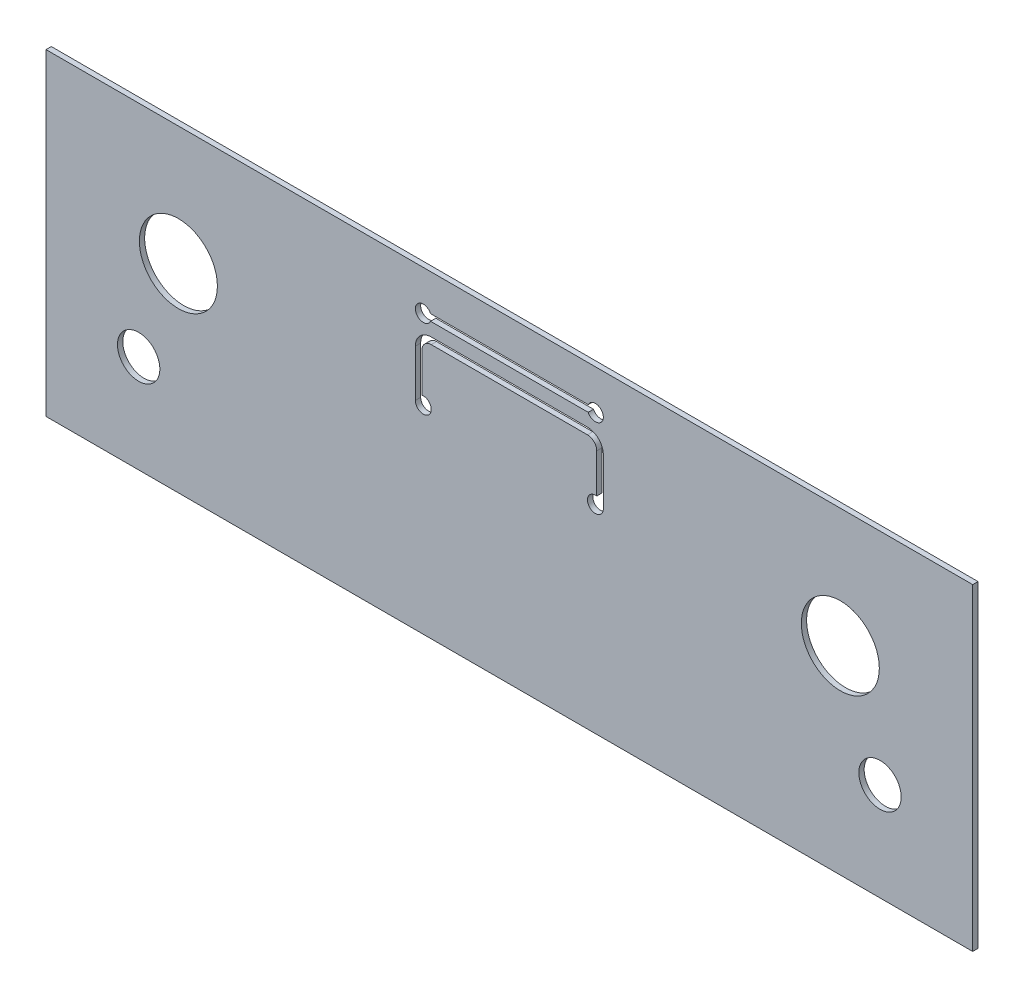
ISO-10303-21;
HEADER;
FILE_DESCRIPTION(('STEP AP214'),'2;1');
FILE_NAME('part.step','',(''),(''),'','','');
FILE_SCHEMA(('AUTOMOTIVE_DESIGN { 1 0 10303 214 1 1 1 1 }'));
ENDSEC;
DATA;
#1=APPLICATION_CONTEXT('core data for automotive mechanical design processes');
#2=APPLICATION_PROTOCOL_DEFINITION('international standard','automotive_design',2000,#1);
#3=PRODUCT_CONTEXT('',#1,'mechanical');
#4=PRODUCT('Part','Part','',(#3));
#5=PRODUCT_RELATED_PRODUCT_CATEGORY('part','',(#4));
#6=PRODUCT_DEFINITION_FORMATION('','',#4);
#7=PRODUCT_DEFINITION_CONTEXT('part definition',#1,'design');
#8=PRODUCT_DEFINITION('design','',#6,#7);
#9=PRODUCT_DEFINITION_SHAPE('','',#8);
#10=(LENGTH_UNIT() NAMED_UNIT(*) SI_UNIT(.MILLI.,.METRE.));
#11=(NAMED_UNIT(*) PLANE_ANGLE_UNIT() SI_UNIT($,.RADIAN.));
#12=(NAMED_UNIT(*) SI_UNIT($,.STERADIAN.) SOLID_ANGLE_UNIT());
#13=UNCERTAINTY_MEASURE_WITH_UNIT(LENGTH_MEASURE(1.E-05),#10,'distance_accuracy_value','');
#14=(GEOMETRIC_REPRESENTATION_CONTEXT(3) GLOBAL_UNCERTAINTY_ASSIGNED_CONTEXT((#13)) GLOBAL_UNIT_ASSIGNED_CONTEXT((#10,
#11,#12)) REPRESENTATION_CONTEXT('',''));
#15=CARTESIAN_POINT('',(0.,0.,0.));
#16=DIRECTION('',(0.,0.,1.));
#17=DIRECTION('',(1.,0.,0.));
#18=AXIS2_PLACEMENT_3D('',#15,#16,#17);
#19=CARTESIAN_POINT('',(0.,0.,0.2));
#20=DIRECTION('',(0.,0.,-1.));
#21=DIRECTION('',(-1.,0.,0.));
#22=AXIS2_PLACEMENT_3D('',#19,#20,#21);
#23=PLANE('',#22);
#24=CARTESIAN_POINT('',(30.,-4.5,0.2));
#25=DIRECTION('',(0.,0.,1.));
#26=DIRECTION('',(1.,0.,0.));
#27=AXIS2_PLACEMENT_3D('',#24,#25,#26);
#28=CIRCLE('',#27,1.4732);
#29=CARTESIAN_POINT('',(31.4732,-4.5,0.2));
#30=VERTEX_POINT('',#29);
#31=EDGE_CURVE('E201',#30,#30,#28,.T.);
#32=ORIENTED_EDGE('',*,*,#31,.F.);
#33=EDGE_LOOP('',(#32));
#34=FACE_BOUND('',#33,.T.);
#35=CARTESIAN_POINT('',(14.25,-4.5,0.2));
#36=DIRECTION('',(0.,0.,1.));
#37=DIRECTION('',(1.,0.,0.));
#38=AXIS2_PLACEMENT_3D('',#35,#36,#37);
#39=CIRCLE('',#38,0.3);
#40=CARTESIAN_POINT('',(13.95,-4.5,0.2));
#41=VERTEX_POINT('',#40);
#42=CARTESIAN_POINT('',(14.2,-4.20419601084502,0.2));
#43=VERTEX_POINT('',#42);
#44=EDGE_CURVE('E211',#41,#43,#39,.T.);
#45=ORIENTED_EDGE('',*,*,#44,.F.);
#46=DIRECTION('',(0.,-1.,0.));
#47=VECTOR('',#46,1.);
#48=CARTESIAN_POINT('',(13.95,-4.5,0.2));
#49=LINE('',#48,#47);
#50=CARTESIAN_POINT('',(13.95,-2.725,0.2));
#51=VERTEX_POINT('',#50);
#52=EDGE_CURVE('E235',#51,#41,#49,.T.);
#53=ORIENTED_EDGE('',*,*,#52,.F.);
#54=CARTESIAN_POINT('',(14.55,-2.725,0.2));
#55=DIRECTION('',(0.,0.,1.));
#56=DIRECTION('',(-1.,0.,0.));
#57=AXIS2_PLACEMENT_3D('',#54,#55,#56);
#58=CIRCLE('',#57,0.6);
#59=CARTESIAN_POINT('',(14.55,-2.125,0.2));
#60=VERTEX_POINT('',#59);
#61=EDGE_CURVE('E232',#60,#51,#58,.T.);
#62=ORIENTED_EDGE('',*,*,#61,.F.);
#63=DIRECTION('',(-1.,0.,0.));
#64=VECTOR('',#63,1.);
#65=CARTESIAN_POINT('',(14.55,-2.125,0.2));
#66=LINE('',#65,#64);
#67=CARTESIAN_POINT('',(20.45,-2.125,0.2));
#68=VERTEX_POINT('',#67);
#69=EDGE_CURVE('E230',#68,#60,#66,.T.);
#70=ORIENTED_EDGE('',*,*,#69,.F.);
#71=CARTESIAN_POINT('',(20.45,-2.725,0.2));
#72=DIRECTION('',(0.,0.,1.));
#73=DIRECTION('',(-1.,0.,0.));
#74=AXIS2_PLACEMENT_3D('',#71,#72,#73);
#75=CIRCLE('',#74,0.6);
#76=CARTESIAN_POINT('',(21.05,-2.725,0.2));
#77=VERTEX_POINT('',#76);
#78=EDGE_CURVE('E228',#77,#68,#75,.T.);
#79=ORIENTED_EDGE('',*,*,#78,.F.);
#80=DIRECTION('',(0.,1.,0.));
#81=VECTOR('',#80,1.);
#82=CARTESIAN_POINT('',(21.05,-2.725,0.2));
#83=LINE('',#82,#81);
#84=CARTESIAN_POINT('',(21.05,-4.5,0.2));
#85=VERTEX_POINT('',#84);
#86=EDGE_CURVE('E226',#85,#77,#83,.T.);
#87=ORIENTED_EDGE('',*,*,#86,.F.);
#88=CARTESIAN_POINT('',(20.75,-4.5,0.2));
#89=DIRECTION('',(0.,0.,1.));
#90=DIRECTION('',(1.,0.,0.));
#91=AXIS2_PLACEMENT_3D('',#88,#89,#90);
#92=CIRCLE('',#91,0.299999999999999);
#93=CARTESIAN_POINT('',(20.8,-4.20419601084502,0.2));
#94=VERTEX_POINT('',#93);
#95=EDGE_CURVE('E224',#94,#85,#92,.T.);
#96=ORIENTED_EDGE('',*,*,#95,.F.);
#97=DIRECTION('',(0.,-1.,0.));
#98=VECTOR('',#97,1.);
#99=CARTESIAN_POINT('',(20.8,-2.725,0.2));
#100=LINE('',#99,#98);
#101=CARTESIAN_POINT('',(20.8,-2.725,0.2));
#102=VERTEX_POINT('',#101);
#103=EDGE_CURVE('E222',#102,#94,#100,.T.);
#104=ORIENTED_EDGE('',*,*,#103,.F.);
#105=CARTESIAN_POINT('',(20.45,-2.725,0.2));
#106=DIRECTION('',(0.,0.,-1.));
#107=DIRECTION('',(-1.,0.,0.));
#108=AXIS2_PLACEMENT_3D('',#105,#106,#107);
#109=CIRCLE('',#108,0.35);
#110=CARTESIAN_POINT('',(20.45,-2.375,0.2));
#111=VERTEX_POINT('',#110);
#112=EDGE_CURVE('E220',#111,#102,#109,.T.);
#113=ORIENTED_EDGE('',*,*,#112,.F.);
#114=DIRECTION('',(1.,0.,0.));
#115=VECTOR('',#114,1.);
#116=CARTESIAN_POINT('',(14.55,-2.375,0.2));
#117=LINE('',#116,#115);
#118=CARTESIAN_POINT('',(14.55,-2.375,0.2));
#119=VERTEX_POINT('',#118);
#120=EDGE_CURVE('E218',#119,#111,#117,.T.);
#121=ORIENTED_EDGE('',*,*,#120,.F.);
#122=CARTESIAN_POINT('',(14.55,-2.725,0.2));
#123=DIRECTION('',(0.,0.,-1.));
#124=DIRECTION('',(-1.,0.,0.));
#125=AXIS2_PLACEMENT_3D('',#122,#123,#124);
#126=CIRCLE('',#125,0.35);
#127=CARTESIAN_POINT('',(14.2,-2.725,0.2));
#128=VERTEX_POINT('',#127);
#129=EDGE_CURVE('E216',#128,#119,#126,.T.);
#130=ORIENTED_EDGE('',*,*,#129,.F.);
#131=DIRECTION('',(0.,1.,0.));
#132=VECTOR('',#131,1.);
#133=CARTESIAN_POINT('',(14.2,-4.20419601084502,0.2));
#134=LINE('',#133,#132);
#135=EDGE_CURVE('E213',#43,#128,#134,.T.);
#136=ORIENTED_EDGE('',*,*,#135,.F.);
#137=EDGE_LOOP('',(#45,#53,#62,#70,#79,#87,#96,#104,#113,#121,#130,#136));
#138=FACE_BOUND('',#137,.T.);
#139=CARTESIAN_POINT('',(3.5,-8.3,0.2));
#140=DIRECTION('',(0.,0.,1.));
#141=DIRECTION('',(1.,0.,0.));
#142=AXIS2_PLACEMENT_3D('',#139,#140,#141);
#143=CIRCLE('',#142,0.800100000000002);
#144=CARTESIAN_POINT('',(4.3001,-8.3,0.2));
#145=VERTEX_POINT('',#144);
#146=EDGE_CURVE('E304',#145,#145,#143,.T.);
#147=ORIENTED_EDGE('',*,*,#146,.F.);
#148=EDGE_LOOP('',(#147));
#149=FACE_BOUND('',#148,.T.);
#150=DIRECTION('',(0.,-1.,0.));
#151=VECTOR('',#150,1.);
#152=CARTESIAN_POINT('',(0.,-12.,0.2));
#153=LINE('',#152,#151);
#154=CARTESIAN_POINT('',(0.,0.,0.2));
#155=VERTEX_POINT('',#154);
#156=CARTESIAN_POINT('',(0.,-12.,0.2));
#157=VERTEX_POINT('',#156);
#158=EDGE_CURVE('E310',#155,#157,#153,.T.);
#159=ORIENTED_EDGE('',*,*,#158,.T.);
#160=DIRECTION('',(1.,0.,0.));
#161=VECTOR('',#160,1.);
#162=CARTESIAN_POINT('',(35.,-12.,0.2));
#163=LINE('',#162,#161);
#164=CARTESIAN_POINT('',(35.,-12.,0.2));
#165=VERTEX_POINT('',#164);
#166=EDGE_CURVE('E313',#157,#165,#163,.T.);
#167=ORIENTED_EDGE('',*,*,#166,.T.);
#168=DIRECTION('',(0.,1.,0.));
#169=VECTOR('',#168,1.);
#170=CARTESIAN_POINT('',(35.,0.,0.2));
#171=LINE('',#170,#169);
#172=CARTESIAN_POINT('',(35.,0.,0.2));
#173=VERTEX_POINT('',#172);
#174=EDGE_CURVE('E316',#165,#173,#171,.T.);
#175=ORIENTED_EDGE('',*,*,#174,.T.);
#176=DIRECTION('',(-1.,0.,0.));
#177=VECTOR('',#176,1.);
#178=CARTESIAN_POINT('',(0.,0.,0.2));
#179=LINE('',#178,#177);
#180=EDGE_CURVE('E318',#173,#155,#179,.T.);
#181=ORIENTED_EDGE('',*,*,#180,.T.);
#182=EDGE_LOOP('',(#159,#167,#175,#181));
#183=FACE_BOUND('',#182,.T.);
#184=CARTESIAN_POINT('',(5.,-4.5,0.2));
#185=DIRECTION('',(0.,0.,1.));
#186=DIRECTION('',(1.,0.,0.));
#187=AXIS2_PLACEMENT_3D('',#184,#185,#186);
#188=CIRCLE('',#187,1.4732);
#189=CARTESIAN_POINT('',(6.4732,-4.5,0.2));
#190=VERTEX_POINT('',#189);
#191=EDGE_CURVE('E298',#190,#190,#188,.T.);
#192=ORIENTED_EDGE('',*,*,#191,.F.);
#193=EDGE_LOOP('',(#192));
#194=FACE_BOUND('',#193,.T.);
#195=CARTESIAN_POINT('',(14.25,-1.5,0.2));
#196=DIRECTION('',(0.,0.,1.));
#197=DIRECTION('',(1.,0.,0.));
#198=AXIS2_PLACEMENT_3D('',#195,#196,#197);
#199=CIRCLE('',#198,0.299999999999999);
#200=CARTESIAN_POINT('',(14.5227178028659,-1.375,0.2));
#201=VERTEX_POINT('',#200);
#202=CARTESIAN_POINT('',(14.5227178028659,-1.625,0.2));
#203=VERTEX_POINT('',#202);
#204=EDGE_CURVE('E172',#201,#203,#199,.T.);
#205=ORIENTED_EDGE('',*,*,#204,.F.);
#206=DIRECTION('',(-1.,0.,0.));
#207=VECTOR('',#206,1.);
#208=CARTESIAN_POINT('',(14.5227178028659,-1.375,0.2));
#209=LINE('',#208,#207);
#210=CARTESIAN_POINT('',(20.4772821971341,-1.375,0.2));
#211=VERTEX_POINT('',#210);
#212=EDGE_CURVE('E195',#211,#201,#209,.T.);
#213=ORIENTED_EDGE('',*,*,#212,.F.);
#214=CARTESIAN_POINT('',(20.75,-1.5,0.2));
#215=DIRECTION('',(0.,0.,1.));
#216=DIRECTION('',(1.,0.,0.));
#217=AXIS2_PLACEMENT_3D('',#214,#215,#216);
#218=CIRCLE('',#217,0.300000000000001);
#219=CARTESIAN_POINT('',(20.4772821971341,-1.625,0.2));
#220=VERTEX_POINT('',#219);
#221=EDGE_CURVE('E193',#220,#211,#218,.T.);
#222=ORIENTED_EDGE('',*,*,#221,.F.);
#223=DIRECTION('',(1.,0.,0.));
#224=VECTOR('',#223,1.);
#225=CARTESIAN_POINT('',(14.5227178028659,-1.625,0.2));
#226=LINE('',#225,#224);
#227=EDGE_CURVE('E180',#203,#220,#226,.T.);
#228=ORIENTED_EDGE('',*,*,#227,.F.);
#229=EDGE_LOOP('',(#205,#213,#222,#228));
#230=FACE_BOUND('',#229,.T.);
#231=CARTESIAN_POINT('',(31.5,-8.3,0.2));
#232=DIRECTION('',(0.,0.,1.));
#233=DIRECTION('',(1.,0.,0.));
#234=AXIS2_PLACEMENT_3D('',#231,#232,#233);
#235=CIRCLE('',#234,0.800100000000007);
#236=CARTESIAN_POINT('',(32.3001,-8.3,0.2));
#237=VERTEX_POINT('',#236);
#238=EDGE_CURVE('E465',#237,#237,#235,.T.);
#239=ORIENTED_EDGE('',*,*,#238,.F.);
#240=EDGE_LOOP('',(#239));
#241=FACE_BOUND('',#240,.T.);
#242=ADVANCED_FACE('F35',(#34,#138,#149,#183,#194,#230,#241),#23,.F.);
#243=CARTESIAN_POINT('',(0.,0.,0.));
#244=DIRECTION('',(0.,0.,-1.));
#245=DIRECTION('',(-1.,0.,0.));
#246=AXIS2_PLACEMENT_3D('',#243,#244,#245);
#247=PLANE('',#246);
#248=CARTESIAN_POINT('',(30.,-4.5,0.));
#249=DIRECTION('',(0.,0.,1.));
#250=DIRECTION('',(1.,0.,0.));
#251=AXIS2_PLACEMENT_3D('',#248,#249,#250);
#252=CIRCLE('',#251,1.4732);
#253=CARTESIAN_POINT('',(31.4732,-4.5,0.));
#254=VERTEX_POINT('',#253);
#255=EDGE_CURVE('E471',#254,#254,#252,.T.);
#256=ORIENTED_EDGE('',*,*,#255,.T.);
#257=EDGE_LOOP('',(#256));
#258=FACE_BOUND('',#257,.T.);
#259=DIRECTION('',(0.,-1.,0.));
#260=VECTOR('',#259,1.);
#261=CARTESIAN_POINT('',(13.95,-4.5,0.));
#262=LINE('',#261,#260);
#263=CARTESIAN_POINT('',(13.95,-2.725,0.));
#264=VERTEX_POINT('',#263);
#265=CARTESIAN_POINT('',(13.95,-4.5,0.));
#266=VERTEX_POINT('',#265);
#267=EDGE_CURVE('E214',#264,#266,#262,.T.);
#268=ORIENTED_EDGE('',*,*,#267,.T.);
#269=CARTESIAN_POINT('',(14.25,-4.5,0.));
#270=DIRECTION('',(0.,0.,1.));
#271=DIRECTION('',(1.,0.,0.));
#272=AXIS2_PLACEMENT_3D('',#269,#270,#271);
#273=CIRCLE('',#272,0.3);
#274=CARTESIAN_POINT('',(14.2,-4.20419601084502,0.));
#275=VERTEX_POINT('',#274);
#276=EDGE_CURVE('E188',#266,#275,#273,.T.);
#277=ORIENTED_EDGE('',*,*,#276,.T.);
#278=DIRECTION('',(0.,1.,0.));
#279=VECTOR('',#278,1.);
#280=CARTESIAN_POINT('',(14.2,-4.20419601084502,0.));
#281=LINE('',#280,#279);
#282=CARTESIAN_POINT('',(14.2,-2.725,0.));
#283=VERTEX_POINT('',#282);
#284=EDGE_CURVE('E240',#275,#283,#281,.T.);
#285=ORIENTED_EDGE('',*,*,#284,.T.);
#286=CARTESIAN_POINT('',(14.55,-2.725,0.));
#287=DIRECTION('',(0.,0.,-1.));
#288=DIRECTION('',(-1.,0.,0.));
#289=AXIS2_PLACEMENT_3D('',#286,#287,#288);
#290=CIRCLE('',#289,0.35);
#291=CARTESIAN_POINT('',(14.55,-2.375,0.));
#292=VERTEX_POINT('',#291);
#293=EDGE_CURVE('E243',#283,#292,#290,.T.);
#294=ORIENTED_EDGE('',*,*,#293,.T.);
#295=DIRECTION('',(1.,0.,0.));
#296=VECTOR('',#295,1.);
#297=CARTESIAN_POINT('',(14.55,-2.375,0.));
#298=LINE('',#297,#296);
#299=CARTESIAN_POINT('',(20.45,-2.375,0.));
#300=VERTEX_POINT('',#299);
#301=EDGE_CURVE('E246',#292,#300,#298,.T.);
#302=ORIENTED_EDGE('',*,*,#301,.T.);
#303=CARTESIAN_POINT('',(20.45,-2.725,0.));
#304=DIRECTION('',(0.,0.,-1.));
#305=DIRECTION('',(-1.,0.,0.));
#306=AXIS2_PLACEMENT_3D('',#303,#304,#305);
#307=CIRCLE('',#306,0.35);
#308=CARTESIAN_POINT('',(20.8,-2.725,0.));
#309=VERTEX_POINT('',#308);
#310=EDGE_CURVE('E249',#300,#309,#307,.T.);
#311=ORIENTED_EDGE('',*,*,#310,.T.);
#312=DIRECTION('',(0.,-1.,0.));
#313=VECTOR('',#312,1.);
#314=CARTESIAN_POINT('',(20.8,-2.725,0.));
#315=LINE('',#314,#313);
#316=CARTESIAN_POINT('',(20.8,-4.20419601084502,0.));
#317=VERTEX_POINT('',#316);
#318=EDGE_CURVE('E252',#309,#317,#315,.T.);
#319=ORIENTED_EDGE('',*,*,#318,.T.);
#320=CARTESIAN_POINT('',(20.75,-4.5,0.));
#321=DIRECTION('',(0.,0.,1.));
#322=DIRECTION('',(1.,0.,0.));
#323=AXIS2_PLACEMENT_3D('',#320,#321,#322);
#324=CIRCLE('',#323,0.299999999999999);
#325=CARTESIAN_POINT('',(21.05,-4.5,0.));
#326=VERTEX_POINT('',#325);
#327=EDGE_CURVE('E255',#317,#326,#324,.T.);
#328=ORIENTED_EDGE('',*,*,#327,.T.);
#329=DIRECTION('',(0.,1.,0.));
#330=VECTOR('',#329,1.);
#331=CARTESIAN_POINT('',(21.05,-2.725,0.));
#332=LINE('',#331,#330);
#333=CARTESIAN_POINT('',(21.05,-2.725,0.));
#334=VERTEX_POINT('',#333);
#335=EDGE_CURVE('E258',#326,#334,#332,.T.);
#336=ORIENTED_EDGE('',*,*,#335,.T.);
#337=CARTESIAN_POINT('',(20.45,-2.725,0.));
#338=DIRECTION('',(0.,0.,1.));
#339=DIRECTION('',(-1.,0.,0.));
#340=AXIS2_PLACEMENT_3D('',#337,#338,#339);
#341=CIRCLE('',#340,0.6);
#342=CARTESIAN_POINT('',(20.45,-2.125,0.));
#343=VERTEX_POINT('',#342);
#344=EDGE_CURVE('E261',#334,#343,#341,.T.);
#345=ORIENTED_EDGE('',*,*,#344,.T.);
#346=DIRECTION('',(-1.,0.,0.));
#347=VECTOR('',#346,1.);
#348=CARTESIAN_POINT('',(14.55,-2.125,0.));
#349=LINE('',#348,#347);
#350=CARTESIAN_POINT('',(14.55,-2.125,0.));
#351=VERTEX_POINT('',#350);
#352=EDGE_CURVE('E264',#343,#351,#349,.T.);
#353=ORIENTED_EDGE('',*,*,#352,.T.);
#354=CARTESIAN_POINT('',(14.55,-2.725,0.));
#355=DIRECTION('',(0.,0.,1.));
#356=DIRECTION('',(-1.,0.,0.));
#357=AXIS2_PLACEMENT_3D('',#354,#355,#356);
#358=CIRCLE('',#357,0.6);
#359=EDGE_CURVE('E267',#351,#264,#358,.T.);
#360=ORIENTED_EDGE('',*,*,#359,.T.);
#361=EDGE_LOOP('',(#268,#277,#285,#294,#302,#311,#319,#328,#336,#345,#353,#360));
#362=FACE_BOUND('',#361,.T.);
#363=CARTESIAN_POINT('',(3.5,-8.3,0.));
#364=DIRECTION('',(0.,0.,1.));
#365=DIRECTION('',(1.,0.,0.));
#366=AXIS2_PLACEMENT_3D('',#363,#364,#365);
#367=CIRCLE('',#366,0.800100000000002);
#368=CARTESIAN_POINT('',(4.3001,-8.3,0.));
#369=VERTEX_POINT('',#368);
#370=EDGE_CURVE('E301',#369,#369,#367,.T.);
#371=ORIENTED_EDGE('',*,*,#370,.T.);
#372=EDGE_LOOP('',(#371));
#373=FACE_BOUND('',#372,.T.);
#374=DIRECTION('',(0.,-1.,0.));
#375=VECTOR('',#374,1.);
#376=CARTESIAN_POINT('',(0.,-12.,0.));
#377=LINE('',#376,#375);
#378=CARTESIAN_POINT('',(0.,0.,0.));
#379=VERTEX_POINT('',#378);
#380=CARTESIAN_POINT('',(0.,-12.,0.));
#381=VERTEX_POINT('',#380);
#382=EDGE_CURVE('E307',#379,#381,#377,.T.);
#383=ORIENTED_EDGE('',*,*,#382,.F.);
#384=DIRECTION('',(-1.,0.,0.));
#385=VECTOR('',#384,1.);
#386=CARTESIAN_POINT('',(0.,0.,0.));
#387=LINE('',#386,#385);
#388=CARTESIAN_POINT('',(35.,0.,0.));
#389=VERTEX_POINT('',#388);
#390=EDGE_CURVE('E314',#389,#379,#387,.T.);
#391=ORIENTED_EDGE('',*,*,#390,.F.);
#392=DIRECTION('',(0.,1.,0.));
#393=VECTOR('',#392,1.);
#394=CARTESIAN_POINT('',(35.,0.,0.));
#395=LINE('',#394,#393);
#396=CARTESIAN_POINT('',(35.,-12.,0.));
#397=VERTEX_POINT('',#396);
#398=EDGE_CURVE('E325',#397,#389,#395,.T.);
#399=ORIENTED_EDGE('',*,*,#398,.F.);
#400=DIRECTION('',(1.,0.,0.));
#401=VECTOR('',#400,1.);
#402=CARTESIAN_POINT('',(35.,-12.,0.));
#403=LINE('',#402,#401);
#404=EDGE_CURVE('E323',#381,#397,#403,.T.);
#405=ORIENTED_EDGE('',*,*,#404,.F.);
#406=EDGE_LOOP('',(#383,#391,#399,#405));
#407=FACE_BOUND('',#406,.T.);
#408=CARTESIAN_POINT('',(5.,-4.5,0.));
#409=DIRECTION('',(0.,0.,1.));
#410=DIRECTION('',(1.,0.,0.));
#411=AXIS2_PLACEMENT_3D('',#408,#409,#410);
#412=CIRCLE('',#411,1.4732);
#413=CARTESIAN_POINT('',(6.4732,-4.5,0.));
#414=VERTEX_POINT('',#413);
#415=EDGE_CURVE('E297',#414,#414,#412,.T.);
#416=ORIENTED_EDGE('',*,*,#415,.T.);
#417=EDGE_LOOP('',(#416));
#418=FACE_BOUND('',#417,.T.);
#419=DIRECTION('',(-1.,0.,0.));
#420=VECTOR('',#419,1.);
#421=CARTESIAN_POINT('',(14.5227178028659,-1.375,0.));
#422=LINE('',#421,#420);
#423=CARTESIAN_POINT('',(20.4772821971341,-1.375,0.));
#424=VERTEX_POINT('',#423);
#425=CARTESIAN_POINT('',(14.5227178028659,-1.375,0.));
#426=VERTEX_POINT('',#425);
#427=EDGE_CURVE('E181',#424,#426,#422,.T.);
#428=ORIENTED_EDGE('',*,*,#427,.T.);
#429=CARTESIAN_POINT('',(14.25,-1.5,0.));
#430=DIRECTION('',(0.,0.,1.));
#431=DIRECTION('',(1.,0.,0.));
#432=AXIS2_PLACEMENT_3D('',#429,#430,#431);
#433=CIRCLE('',#432,0.299999999999999);
#434=CARTESIAN_POINT('',(14.5227178028659,-1.625,0.));
#435=VERTEX_POINT('',#434);
#436=EDGE_CURVE('E58',#426,#435,#433,.T.);
#437=ORIENTED_EDGE('',*,*,#436,.T.);
#438=DIRECTION('',(1.,0.,0.));
#439=VECTOR('',#438,1.);
#440=CARTESIAN_POINT('',(14.5227178028659,-1.625,0.));
#441=LINE('',#440,#439);
#442=CARTESIAN_POINT('',(20.4772821971341,-1.625,0.));
#443=VERTEX_POINT('',#442);
#444=EDGE_CURVE('E187',#435,#443,#441,.T.);
#445=ORIENTED_EDGE('',*,*,#444,.T.);
#446=CARTESIAN_POINT('',(20.75,-1.5,0.));
#447=DIRECTION('',(0.,0.,1.));
#448=DIRECTION('',(1.,0.,0.));
#449=AXIS2_PLACEMENT_3D('',#446,#447,#448);
#450=CIRCLE('',#449,0.300000000000001);
#451=EDGE_CURVE('E203',#443,#424,#450,.T.);
#452=ORIENTED_EDGE('',*,*,#451,.T.);
#453=EDGE_LOOP('',(#428,#437,#445,#452));
#454=FACE_BOUND('',#453,.T.);
#455=CARTESIAN_POINT('',(31.5,-8.3,0.));
#456=DIRECTION('',(0.,0.,1.));
#457=DIRECTION('',(1.,0.,0.));
#458=AXIS2_PLACEMENT_3D('',#455,#456,#457);
#459=CIRCLE('',#458,0.800100000000007);
#460=CARTESIAN_POINT('',(32.3001,-8.3,0.));
#461=VERTEX_POINT('',#460);
#462=EDGE_CURVE('E468',#461,#461,#459,.T.);
#463=ORIENTED_EDGE('',*,*,#462,.T.);
#464=EDGE_LOOP('',(#463));
#465=FACE_BOUND('',#464,.T.);
#466=ADVANCED_FACE('F343',(#258,#362,#373,#407,#418,#454,#465),#247,.T.);
#467=CARTESIAN_POINT('',(0.,-12.,0.2));
#468=DIRECTION('',(1.,0.,0.));
#469=DIRECTION('',(0.,0.,-1.));
#470=AXIS2_PLACEMENT_3D('',#467,#468,#469);
#471=PLANE('',#470);
#472=ORIENTED_EDGE('',*,*,#382,.T.);
#473=DIRECTION('',(0.,0.,-1.));
#474=VECTOR('',#473,1.);
#475=CARTESIAN_POINT('',(0.,-12.,0.2));
#476=LINE('',#475,#474);
#477=EDGE_CURVE('E11',#157,#381,#476,.T.);
#478=ORIENTED_EDGE('',*,*,#477,.F.);
#479=ORIENTED_EDGE('',*,*,#158,.F.);
#480=DIRECTION('',(0.,0.,-1.));
#481=VECTOR('',#480,1.);
#482=CARTESIAN_POINT('',(0.,0.,0.2));
#483=LINE('',#482,#481);
#484=EDGE_CURVE('E320',#155,#379,#483,.T.);
#485=ORIENTED_EDGE('',*,*,#484,.T.);
#486=EDGE_LOOP('',(#472,#478,#479,#485));
#487=FACE_BOUND('',#486,.T.);
#488=ADVANCED_FACE('F37',(#487),#471,.F.);
#489=CARTESIAN_POINT('',(35.,-12.,0.2));
#490=DIRECTION('',(0.,1.,0.));
#491=DIRECTION('',(-1.,0.,0.));
#492=AXIS2_PLACEMENT_3D('',#489,#490,#491);
#493=PLANE('',#492);
#494=ORIENTED_EDGE('',*,*,#404,.T.);
#495=DIRECTION('',(0.,0.,-1.));
#496=VECTOR('',#495,1.);
#497=CARTESIAN_POINT('',(35.,-12.,0.2));
#498=LINE('',#497,#496);
#499=EDGE_CURVE('E43',#165,#397,#498,.T.);
#500=ORIENTED_EDGE('',*,*,#499,.F.);
#501=ORIENTED_EDGE('',*,*,#166,.F.);
#502=ORIENTED_EDGE('',*,*,#477,.T.);
#503=EDGE_LOOP('',(#494,#500,#501,#502));
#504=FACE_BOUND('',#503,.T.);
#505=ADVANCED_FACE('F354',(#504),#493,.F.);
#506=CARTESIAN_POINT('',(35.,0.,0.2));
#507=DIRECTION('',(-1.,0.,0.));
#508=DIRECTION('',(0.,0.,1.));
#509=AXIS2_PLACEMENT_3D('',#506,#507,#508);
#510=PLANE('',#509);
#511=ORIENTED_EDGE('',*,*,#398,.T.);
#512=DIRECTION('',(0.,0.,-1.));
#513=VECTOR('',#512,1.);
#514=CARTESIAN_POINT('',(35.,0.,0.2));
#515=LINE('',#514,#513);
#516=EDGE_CURVE('E330',#173,#389,#515,.T.);
#517=ORIENTED_EDGE('',*,*,#516,.F.);
#518=ORIENTED_EDGE('',*,*,#174,.F.);
#519=ORIENTED_EDGE('',*,*,#499,.T.);
#520=EDGE_LOOP('',(#511,#517,#518,#519));
#521=FACE_BOUND('',#520,.T.);
#522=ADVANCED_FACE('F337',(#521),#510,.F.);
#523=CARTESIAN_POINT('',(0.,0.,0.2));
#524=DIRECTION('',(0.,-1.,0.));
#525=DIRECTION('',(0.,0.,-1.));
#526=AXIS2_PLACEMENT_3D('',#523,#524,#525);
#527=PLANE('',#526);
#528=ORIENTED_EDGE('',*,*,#390,.T.);
#529=ORIENTED_EDGE('',*,*,#484,.F.);
#530=ORIENTED_EDGE('',*,*,#180,.F.);
#531=ORIENTED_EDGE('',*,*,#516,.T.);
#532=EDGE_LOOP('',(#528,#529,#530,#531));
#533=FACE_BOUND('',#532,.T.);
#534=ADVANCED_FACE('F347',(#533),#527,.F.);
#535=CARTESIAN_POINT('',(3.5,-8.3,0.2));
#536=DIRECTION('',(0.,0.,-1.));
#537=DIRECTION('',(-1.,0.,0.));
#538=AXIS2_PLACEMENT_3D('',#535,#536,#537);
#539=CYLINDRICAL_SURFACE('',#538,0.800100000000002);
#540=ORIENTED_EDGE('',*,*,#146,.T.);
#541=EDGE_LOOP('',(#540));
#542=FACE_BOUND('',#541,.T.);
#543=ORIENTED_EDGE('',*,*,#370,.F.);
#544=EDGE_LOOP('',(#543));
#545=FACE_BOUND('',#544,.T.);
#546=ADVANCED_FACE('F372',(#542,#545),#539,.F.);
#547=CARTESIAN_POINT('',(5.,-4.5,0.2));
#548=DIRECTION('',(0.,0.,-1.));
#549=DIRECTION('',(-1.,0.,0.));
#550=AXIS2_PLACEMENT_3D('',#547,#548,#549);
#551=CYLINDRICAL_SURFACE('',#550,1.4732);
#552=ORIENTED_EDGE('',*,*,#191,.T.);
#553=EDGE_LOOP('',(#552));
#554=FACE_BOUND('',#553,.T.);
#555=ORIENTED_EDGE('',*,*,#415,.F.);
#556=EDGE_LOOP('',(#555));
#557=FACE_BOUND('',#556,.T.);
#558=ADVANCED_FACE('F379',(#554,#557),#551,.F.);
#559=CARTESIAN_POINT('',(14.25,-4.5,0.2));
#560=DIRECTION('',(0.,0.,-1.));
#561=DIRECTION('',(-1.,0.,0.));
#562=AXIS2_PLACEMENT_3D('',#559,#560,#561);
#563=CYLINDRICAL_SURFACE('',#562,0.3);
#564=ORIENTED_EDGE('',*,*,#276,.F.);
#565=DIRECTION('',(0.,0.,-1.));
#566=VECTOR('',#565,1.);
#567=CARTESIAN_POINT('',(13.95,-4.5,0.2));
#568=LINE('',#567,#566);
#569=EDGE_CURVE('E237',#41,#266,#568,.T.);
#570=ORIENTED_EDGE('',*,*,#569,.F.);
#571=ORIENTED_EDGE('',*,*,#44,.T.);
#572=DIRECTION('',(0.,0.,-1.));
#573=VECTOR('',#572,1.);
#574=CARTESIAN_POINT('',(14.2,-4.20419601084502,0.2));
#575=LINE('',#574,#573);
#576=EDGE_CURVE('E294',#43,#275,#575,.T.);
#577=ORIENTED_EDGE('',*,*,#576,.T.);
#578=EDGE_LOOP('',(#564,#570,#571,#577));
#579=FACE_BOUND('',#578,.T.);
#580=ADVANCED_FACE('F384',(#579),#563,.F.);
#581=CARTESIAN_POINT('',(14.2,-4.20419601084502,0.2));
#582=DIRECTION('',(-1.,0.,0.));
#583=DIRECTION('',(0.,0.,1.));
#584=AXIS2_PLACEMENT_3D('',#581,#582,#583);
#585=PLANE('',#584);
#586=ORIENTED_EDGE('',*,*,#284,.F.);
#587=ORIENTED_EDGE('',*,*,#576,.F.);
#588=ORIENTED_EDGE('',*,*,#135,.T.);
#589=DIRECTION('',(0.,0.,-1.));
#590=VECTOR('',#589,1.);
#591=CARTESIAN_POINT('',(14.2,-2.725,0.2));
#592=LINE('',#591,#590);
#593=EDGE_CURVE('E292',#128,#283,#592,.T.);
#594=ORIENTED_EDGE('',*,*,#593,.T.);
#595=EDGE_LOOP('',(#586,#587,#588,#594));
#596=FACE_BOUND('',#595,.T.);
#597=ADVANCED_FACE('F394',(#596),#585,.T.);
#598=CARTESIAN_POINT('',(14.55,-2.725,0.2));
#599=DIRECTION('',(0.,0.,-1.));
#600=DIRECTION('',(-1.,0.,0.));
#601=AXIS2_PLACEMENT_3D('',#598,#599,#600);
#602=CYLINDRICAL_SURFACE('',#601,0.35);
#603=ORIENTED_EDGE('',*,*,#293,.F.);
#604=ORIENTED_EDGE('',*,*,#593,.F.);
#605=ORIENTED_EDGE('',*,*,#129,.T.);
#606=DIRECTION('',(0.,0.,-1.));
#607=VECTOR('',#606,1.);
#608=CARTESIAN_POINT('',(14.55,-2.375,0.2));
#609=LINE('',#608,#607);
#610=EDGE_CURVE('E290',#119,#292,#609,.T.);
#611=ORIENTED_EDGE('',*,*,#610,.T.);
#612=EDGE_LOOP('',(#603,#604,#605,#611));
#613=FACE_BOUND('',#612,.T.);
#614=ADVANCED_FACE('F401',(#613),#602,.T.);
#615=CARTESIAN_POINT('',(14.55,-2.375,0.2));
#616=DIRECTION('',(0.,1.,0.));
#617=DIRECTION('',(-1.,0.,0.));
#618=AXIS2_PLACEMENT_3D('',#615,#616,#617);
#619=PLANE('',#618);
#620=ORIENTED_EDGE('',*,*,#301,.F.);
#621=ORIENTED_EDGE('',*,*,#610,.F.);
#622=ORIENTED_EDGE('',*,*,#120,.T.);
#623=DIRECTION('',(0.,0.,-1.));
#624=VECTOR('',#623,1.);
#625=CARTESIAN_POINT('',(20.45,-2.375,0.2));
#626=LINE('',#625,#624);
#627=EDGE_CURVE('E288',#111,#300,#626,.T.);
#628=ORIENTED_EDGE('',*,*,#627,.T.);
#629=EDGE_LOOP('',(#620,#621,#622,#628));
#630=FACE_BOUND('',#629,.T.);
#631=ADVANCED_FACE('F405',(#630),#619,.T.);
#632=CARTESIAN_POINT('',(20.45,-2.725,0.2));
#633=DIRECTION('',(0.,0.,-1.));
#634=DIRECTION('',(-1.,0.,0.));
#635=AXIS2_PLACEMENT_3D('',#632,#633,#634);
#636=CYLINDRICAL_SURFACE('',#635,0.35);
#637=ORIENTED_EDGE('',*,*,#310,.F.);
#638=ORIENTED_EDGE('',*,*,#627,.F.);
#639=ORIENTED_EDGE('',*,*,#112,.T.);
#640=DIRECTION('',(0.,0.,-1.));
#641=VECTOR('',#640,1.);
#642=CARTESIAN_POINT('',(20.8,-2.725,0.2));
#643=LINE('',#642,#641);
#644=EDGE_CURVE('E286',#102,#309,#643,.T.);
#645=ORIENTED_EDGE('',*,*,#644,.T.);
#646=EDGE_LOOP('',(#637,#638,#639,#645));
#647=FACE_BOUND('',#646,.T.);
#648=ADVANCED_FACE('F409',(#647),#636,.T.);
#649=CARTESIAN_POINT('',(20.8,-2.725,0.2));
#650=DIRECTION('',(1.,0.,0.));
#651=DIRECTION('',(0.,0.,-1.));
#652=AXIS2_PLACEMENT_3D('',#649,#650,#651);
#653=PLANE('',#652);
#654=ORIENTED_EDGE('',*,*,#318,.F.);
#655=ORIENTED_EDGE('',*,*,#644,.F.);
#656=ORIENTED_EDGE('',*,*,#103,.T.);
#657=DIRECTION('',(0.,0.,-1.));
#658=VECTOR('',#657,1.);
#659=CARTESIAN_POINT('',(20.8,-4.20419601084502,0.2));
#660=LINE('',#659,#658);
#661=EDGE_CURVE('E284',#94,#317,#660,.T.);
#662=ORIENTED_EDGE('',*,*,#661,.T.);
#663=EDGE_LOOP('',(#654,#655,#656,#662));
#664=FACE_BOUND('',#663,.T.);
#665=ADVANCED_FACE('F413',(#664),#653,.T.);
#666=CARTESIAN_POINT('',(20.75,-4.5,0.2));
#667=DIRECTION('',(0.,0.,-1.));
#668=DIRECTION('',(-1.,0.,0.));
#669=AXIS2_PLACEMENT_3D('',#666,#667,#668);
#670=CYLINDRICAL_SURFACE('',#669,0.299999999999999);
#671=ORIENTED_EDGE('',*,*,#327,.F.);
#672=ORIENTED_EDGE('',*,*,#661,.F.);
#673=ORIENTED_EDGE('',*,*,#95,.T.);
#674=DIRECTION('',(0.,0.,-1.));
#675=VECTOR('',#674,1.);
#676=CARTESIAN_POINT('',(21.05,-4.5,0.2));
#677=LINE('',#676,#675);
#678=EDGE_CURVE('E282',#85,#326,#677,.T.);
#679=ORIENTED_EDGE('',*,*,#678,.T.);
#680=EDGE_LOOP('',(#671,#672,#673,#679));
#681=FACE_BOUND('',#680,.T.);
#682=ADVANCED_FACE('F417',(#681),#670,.F.);
#683=CARTESIAN_POINT('',(21.05,-2.725,0.2));
#684=DIRECTION('',(-1.,0.,0.));
#685=DIRECTION('',(0.,-1.,0.));
#686=AXIS2_PLACEMENT_3D('',#683,#684,#685);
#687=PLANE('',#686);
#688=ORIENTED_EDGE('',*,*,#335,.F.);
#689=ORIENTED_EDGE('',*,*,#678,.F.);
#690=ORIENTED_EDGE('',*,*,#86,.T.);
#691=DIRECTION('',(0.,0.,-1.));
#692=VECTOR('',#691,1.);
#693=CARTESIAN_POINT('',(21.05,-2.725,0.2));
#694=LINE('',#693,#692);
#695=EDGE_CURVE('E280',#77,#334,#694,.T.);
#696=ORIENTED_EDGE('',*,*,#695,.T.);
#697=EDGE_LOOP('',(#688,#689,#690,#696));
#698=FACE_BOUND('',#697,.T.);
#699=ADVANCED_FACE('F421',(#698),#687,.T.);
#700=CARTESIAN_POINT('',(20.45,-2.725,0.2));
#701=DIRECTION('',(0.,0.,-1.));
#702=DIRECTION('',(-1.,0.,0.));
#703=AXIS2_PLACEMENT_3D('',#700,#701,#702);
#704=CYLINDRICAL_SURFACE('',#703,0.6);
#705=ORIENTED_EDGE('',*,*,#344,.F.);
#706=ORIENTED_EDGE('',*,*,#695,.F.);
#707=ORIENTED_EDGE('',*,*,#78,.T.);
#708=DIRECTION('',(0.,0.,-1.));
#709=VECTOR('',#708,1.);
#710=CARTESIAN_POINT('',(20.45,-2.125,0.2));
#711=LINE('',#710,#709);
#712=EDGE_CURVE('E278',#68,#343,#711,.T.);
#713=ORIENTED_EDGE('',*,*,#712,.T.);
#714=EDGE_LOOP('',(#705,#706,#707,#713));
#715=FACE_BOUND('',#714,.T.);
#716=ADVANCED_FACE('F425',(#715),#704,.F.);
#717=CARTESIAN_POINT('',(14.55,-2.125,0.2));
#718=DIRECTION('',(0.,-1.,0.));
#719=DIRECTION('',(1.,0.,0.));
#720=AXIS2_PLACEMENT_3D('',#717,#718,#719);
#721=PLANE('',#720);
#722=ORIENTED_EDGE('',*,*,#352,.F.);
#723=ORIENTED_EDGE('',*,*,#712,.F.);
#724=ORIENTED_EDGE('',*,*,#69,.T.);
#725=DIRECTION('',(0.,0.,-1.));
#726=VECTOR('',#725,1.);
#727=CARTESIAN_POINT('',(14.55,-2.125,0.2));
#728=LINE('',#727,#726);
#729=EDGE_CURVE('E276',#60,#351,#728,.T.);
#730=ORIENTED_EDGE('',*,*,#729,.T.);
#731=EDGE_LOOP('',(#722,#723,#724,#730));
#732=FACE_BOUND('',#731,.T.);
#733=ADVANCED_FACE('F429',(#732),#721,.T.);
#734=CARTESIAN_POINT('',(14.55,-2.725,0.2));
#735=DIRECTION('',(0.,0.,-1.));
#736=DIRECTION('',(-1.,0.,0.));
#737=AXIS2_PLACEMENT_3D('',#734,#735,#736);
#738=CYLINDRICAL_SURFACE('',#737,0.6);
#739=ORIENTED_EDGE('',*,*,#359,.F.);
#740=ORIENTED_EDGE('',*,*,#729,.F.);
#741=ORIENTED_EDGE('',*,*,#61,.T.);
#742=DIRECTION('',(0.,0.,-1.));
#743=VECTOR('',#742,1.);
#744=CARTESIAN_POINT('',(13.95,-2.725,0.2));
#745=LINE('',#744,#743);
#746=EDGE_CURVE('E274',#51,#264,#745,.T.);
#747=ORIENTED_EDGE('',*,*,#746,.T.);
#748=EDGE_LOOP('',(#739,#740,#741,#747));
#749=FACE_BOUND('',#748,.T.);
#750=ADVANCED_FACE('F433',(#749),#738,.F.);
#751=CARTESIAN_POINT('',(13.95,-4.5,0.2));
#752=DIRECTION('',(1.,0.,0.));
#753=DIRECTION('',(0.,0.,-1.));
#754=AXIS2_PLACEMENT_3D('',#751,#752,#753);
#755=PLANE('',#754);
#756=ORIENTED_EDGE('',*,*,#267,.F.);
#757=ORIENTED_EDGE('',*,*,#746,.F.);
#758=ORIENTED_EDGE('',*,*,#52,.T.);
#759=ORIENTED_EDGE('',*,*,#569,.T.);
#760=EDGE_LOOP('',(#756,#757,#758,#759));
#761=FACE_BOUND('',#760,.T.);
#762=ADVANCED_FACE('F437',(#761),#755,.T.);
#763=CARTESIAN_POINT('',(14.25,-1.5,0.2));
#764=DIRECTION('',(0.,0.,-1.));
#765=DIRECTION('',(-1.,0.,0.));
#766=AXIS2_PLACEMENT_3D('',#763,#764,#765);
#767=CYLINDRICAL_SURFACE('',#766,0.299999999999999);
#768=ORIENTED_EDGE('',*,*,#436,.F.);
#769=DIRECTION('',(0.,0.,-1.));
#770=VECTOR('',#769,1.);
#771=CARTESIAN_POINT('',(14.5227178028659,-1.375,0.2));
#772=LINE('',#771,#770);
#773=EDGE_CURVE('E176',#201,#426,#772,.T.);
#774=ORIENTED_EDGE('',*,*,#773,.F.);
#775=ORIENTED_EDGE('',*,*,#204,.T.);
#776=DIRECTION('',(0.,0.,-1.));
#777=VECTOR('',#776,1.);
#778=CARTESIAN_POINT('',(14.5227178028659,-1.625,0.2));
#779=LINE('',#778,#777);
#780=EDGE_CURVE('E175',#203,#435,#779,.T.);
#781=ORIENTED_EDGE('',*,*,#780,.T.);
#782=EDGE_LOOP('',(#768,#774,#775,#781));
#783=FACE_BOUND('',#782,.T.);
#784=ADVANCED_FACE('F174',(#783),#767,.F.);
#785=CARTESIAN_POINT('',(14.5227178028659,-1.625,0.2));
#786=DIRECTION('',(0.,1.,0.));
#787=DIRECTION('',(-1.,0.,0.));
#788=AXIS2_PLACEMENT_3D('',#785,#786,#787);
#789=PLANE('',#788);
#790=ORIENTED_EDGE('',*,*,#444,.F.);
#791=ORIENTED_EDGE('',*,*,#780,.F.);
#792=ORIENTED_EDGE('',*,*,#227,.T.);
#793=DIRECTION('',(0.,0.,-1.));
#794=VECTOR('',#793,1.);
#795=CARTESIAN_POINT('',(20.4772821971341,-1.625,0.2));
#796=LINE('',#795,#794);
#797=EDGE_CURVE('E189',#220,#443,#796,.T.);
#798=ORIENTED_EDGE('',*,*,#797,.T.);
#799=EDGE_LOOP('',(#790,#791,#792,#798));
#800=FACE_BOUND('',#799,.T.);
#801=ADVANCED_FACE('F184',(#800),#789,.T.);
#802=CARTESIAN_POINT('',(20.75,-1.5,0.2));
#803=DIRECTION('',(0.,0.,-1.));
#804=DIRECTION('',(-1.,0.,0.));
#805=AXIS2_PLACEMENT_3D('',#802,#803,#804);
#806=CYLINDRICAL_SURFACE('',#805,0.300000000000001);
#807=ORIENTED_EDGE('',*,*,#451,.F.);
#808=ORIENTED_EDGE('',*,*,#797,.F.);
#809=ORIENTED_EDGE('',*,*,#221,.T.);
#810=DIRECTION('',(0.,0.,-1.));
#811=VECTOR('',#810,1.);
#812=CARTESIAN_POINT('',(20.4772821971341,-1.375,0.2));
#813=LINE('',#812,#811);
#814=EDGE_CURVE('E50',#211,#424,#813,.T.);
#815=ORIENTED_EDGE('',*,*,#814,.T.);
#816=EDGE_LOOP('',(#807,#808,#809,#815));
#817=FACE_BOUND('',#816,.T.);
#818=ADVANCED_FACE('F446',(#817),#806,.F.);
#819=CARTESIAN_POINT('',(14.5227178028659,-1.375,0.2));
#820=DIRECTION('',(0.,-1.,0.));
#821=DIRECTION('',(1.,0.,0.));
#822=AXIS2_PLACEMENT_3D('',#819,#820,#821);
#823=PLANE('',#822);
#824=ORIENTED_EDGE('',*,*,#427,.F.);
#825=ORIENTED_EDGE('',*,*,#814,.F.);
#826=ORIENTED_EDGE('',*,*,#212,.T.);
#827=ORIENTED_EDGE('',*,*,#773,.T.);
#828=EDGE_LOOP('',(#824,#825,#826,#827));
#829=FACE_BOUND('',#828,.T.);
#830=ADVANCED_FACE('F449',(#829),#823,.T.);
#831=CARTESIAN_POINT('',(30.,-4.5,0.2));
#832=DIRECTION('',(0.,0.,-1.));
#833=DIRECTION('',(-1.,0.,0.));
#834=AXIS2_PLACEMENT_3D('',#831,#832,#833);
#835=CYLINDRICAL_SURFACE('',#834,1.4732);
#836=ORIENTED_EDGE('',*,*,#31,.T.);
#837=EDGE_LOOP('',(#836));
#838=FACE_BOUND('',#837,.T.);
#839=ORIENTED_EDGE('',*,*,#255,.F.);
#840=EDGE_LOOP('',(#839));
#841=FACE_BOUND('',#840,.T.);
#842=ADVANCED_FACE('F453',(#838,#841),#835,.F.);
#843=CARTESIAN_POINT('',(31.5,-8.3,0.2));
#844=DIRECTION('',(0.,0.,-1.));
#845=DIRECTION('',(-1.,0.,0.));
#846=AXIS2_PLACEMENT_3D('',#843,#844,#845);
#847=CYLINDRICAL_SURFACE('',#846,0.800100000000007);
#848=ORIENTED_EDGE('',*,*,#238,.T.);
#849=EDGE_LOOP('',(#848));
#850=FACE_BOUND('',#849,.T.);
#851=ORIENTED_EDGE('',*,*,#462,.F.);
#852=EDGE_LOOP('',(#851));
#853=FACE_BOUND('',#852,.T.);
#854=ADVANCED_FACE('F456',(#850,#853),#847,.F.);
#855=CLOSED_SHELL('',(#242,#466,#488,#505,#522,#534,#546,#558,#580,#597,#614,#631,#648,#665,
#682,#699,#716,#733,#750,#762,#784,#801,#818,#830,#842,#854));
#856=MANIFOLD_SOLID_BREP('B2',#855);
#857=ADVANCED_BREP_SHAPE_REPRESENTATION('',(#18,#856),#14);
#858=SHAPE_DEFINITION_REPRESENTATION(#9,#857);
ENDSEC;
END-ISO-10303-21;
